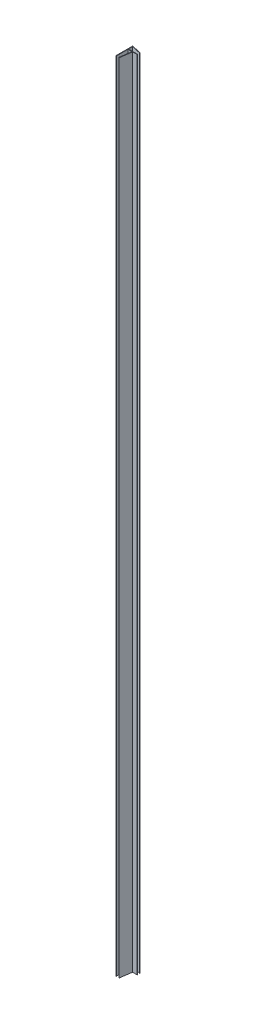
ISO-10303-21;
HEADER;
FILE_DESCRIPTION(('STEP AP214'),'2;1');
FILE_NAME('part.step','',(''),(''),'','','');
FILE_SCHEMA(('AUTOMOTIVE_DESIGN { 1 0 10303 214 1 1 1 1 }'));
ENDSEC;
DATA;
#1=APPLICATION_CONTEXT('core data for automotive mechanical design processes');
#2=APPLICATION_PROTOCOL_DEFINITION('international standard','automotive_design',2000,#1);
#3=PRODUCT_CONTEXT('',#1,'mechanical');
#4=PRODUCT('Part','Part','',(#3));
#5=PRODUCT_RELATED_PRODUCT_CATEGORY('part','',(#4));
#6=PRODUCT_DEFINITION_FORMATION('','',#4);
#7=PRODUCT_DEFINITION_CONTEXT('part definition',#1,'design');
#8=PRODUCT_DEFINITION('design','',#6,#7);
#9=PRODUCT_DEFINITION_SHAPE('','',#8);
#10=(LENGTH_UNIT() NAMED_UNIT(*) SI_UNIT(.MILLI.,.METRE.));
#11=(NAMED_UNIT(*) PLANE_ANGLE_UNIT() SI_UNIT($,.RADIAN.));
#12=(NAMED_UNIT(*) SI_UNIT($,.STERADIAN.) SOLID_ANGLE_UNIT());
#13=UNCERTAINTY_MEASURE_WITH_UNIT(LENGTH_MEASURE(1.E-05),#10,'distance_accuracy_value','');
#14=(GEOMETRIC_REPRESENTATION_CONTEXT(3) GLOBAL_UNCERTAINTY_ASSIGNED_CONTEXT((#13)) GLOBAL_UNIT_ASSIGNED_CONTEXT((#10,
#11,#12)) REPRESENTATION_CONTEXT('',''));
#15=CARTESIAN_POINT('',(0.,0.,0.));
#16=DIRECTION('',(0.,0.,1.));
#17=DIRECTION('',(1.,0.,0.));
#18=AXIS2_PLACEMENT_3D('',#15,#16,#17);
#19=CARTESIAN_POINT('',(-12.,2080.72,22.));
#20=DIRECTION('',(0.,0.,-1.));
#21=DIRECTION('',(-1.,0.,0.));
#22=AXIS2_PLACEMENT_3D('',#19,#20,#21);
#23=PLANE('',#22);
#24=DIRECTION('',(1.,0.,0.));
#25=VECTOR('',#24,1.);
#26=CARTESIAN_POINT('',(-12.,0.,22.));
#27=LINE('',#26,#25);
#28=CARTESIAN_POINT('',(-13.2,0.,22.));
#29=VERTEX_POINT('',#28);
#30=CARTESIAN_POINT('',(-12.,0.,22.));
#31=VERTEX_POINT('',#30);
#32=EDGE_CURVE('E167',#29,#31,#27,.T.);
#33=ORIENTED_EDGE('',*,*,#32,.T.);
#34=DIRECTION('',(0.,-1.,0.));
#35=VECTOR('',#34,1.);
#36=CARTESIAN_POINT('',(-12.,2080.72,22.));
#37=LINE('',#36,#35);
#38=CARTESIAN_POINT('',(-12.,2080.72,22.));
#39=VERTEX_POINT('',#38);
#40=EDGE_CURVE('E11',#39,#31,#37,.T.);
#41=ORIENTED_EDGE('',*,*,#40,.F.);
#42=DIRECTION('',(1.,0.,0.));
#43=VECTOR('',#42,1.);
#44=CARTESIAN_POINT('',(-12.,2080.72,22.));
#45=LINE('',#44,#43);
#46=CARTESIAN_POINT('',(-13.2,2080.72,22.));
#47=VERTEX_POINT('',#46);
#48=EDGE_CURVE('E193',#47,#39,#45,.T.);
#49=ORIENTED_EDGE('',*,*,#48,.F.);
#50=DIRECTION('',(0.,-1.,0.));
#51=VECTOR('',#50,1.);
#52=CARTESIAN_POINT('',(-13.2,2080.72,22.));
#53=LINE('',#52,#51);
#54=EDGE_CURVE('E163',#47,#29,#53,.T.);
#55=ORIENTED_EDGE('',*,*,#54,.T.);
#56=EDGE_LOOP('',(#33,#41,#49,#55));
#57=FACE_BOUND('',#56,.T.);
#58=ADVANCED_FACE('F35',(#57),#23,.F.);
#59=CARTESIAN_POINT('',(-12.,2080.72,22.));
#60=DIRECTION('',(-1.,0.,0.));
#61=DIRECTION('',(0.,0.,1.));
#62=AXIS2_PLACEMENT_3D('',#59,#60,#61);
#63=PLANE('',#62);
#64=DIRECTION('',(0.,0.,-1.));
#65=VECTOR('',#64,1.);
#66=CARTESIAN_POINT('',(-12.,0.,22.));
#67=LINE('',#66,#65);
#68=CARTESIAN_POINT('',(-12.,0.,-8.52573006465875));
#69=VERTEX_POINT('',#68);
#70=EDGE_CURVE('E170',#31,#69,#67,.T.);
#71=ORIENTED_EDGE('',*,*,#70,.T.);
#72=DIRECTION('',(0.,-1.,0.));
#73=VECTOR('',#72,1.);
#74=CARTESIAN_POINT('',(-12.,2080.72,-8.52573006465875));
#75=LINE('',#74,#73);
#76=CARTESIAN_POINT('',(-12.,2080.72,-8.52573006465875));
#77=VERTEX_POINT('',#76);
#78=EDGE_CURVE('E43',#77,#69,#75,.T.);
#79=ORIENTED_EDGE('',*,*,#78,.F.);
#80=DIRECTION('',(0.,0.,-1.));
#81=VECTOR('',#80,1.);
#82=CARTESIAN_POINT('',(-12.,2080.72,22.));
#83=LINE('',#82,#81);
#84=EDGE_CURVE('E112',#39,#77,#83,.T.);
#85=ORIENTED_EDGE('',*,*,#84,.F.);
#86=ORIENTED_EDGE('',*,*,#40,.T.);
#87=EDGE_LOOP('',(#71,#79,#85,#86));
#88=FACE_BOUND('',#87,.T.);
#89=ADVANCED_FACE('F281',(#88),#63,.F.);
#90=CARTESIAN_POINT('',(-12.,2080.72,-8.52573006465875));
#91=DIRECTION('',(0.,0.,-1.));
#92=DIRECTION('',(-1.,0.,0.));
#93=AXIS2_PLACEMENT_3D('',#90,#91,#92);
#94=PLANE('',#93);
#95=DIRECTION('',(1.,0.,0.));
#96=VECTOR('',#95,1.);
#97=CARTESIAN_POINT('',(-12.,0.,-8.52573006465875));
#98=LINE('',#97,#96);
#99=CARTESIAN_POINT('',(-1.20000000000002,0.,-8.52573006465875));
#100=VERTEX_POINT('',#99);
#101=EDGE_CURVE('E172',#69,#100,#98,.T.);
#102=ORIENTED_EDGE('',*,*,#101,.T.);
#103=DIRECTION('',(0.,-1.,0.));
#104=VECTOR('',#103,1.);
#105=CARTESIAN_POINT('',(-1.20000000000002,2080.72,-8.52573006465875));
#106=LINE('',#105,#104);
#107=CARTESIAN_POINT('',(-1.20000000000002,2080.72,-8.52573006465875));
#108=VERTEX_POINT('',#107);
#109=EDGE_CURVE('E218',#108,#100,#106,.T.);
#110=ORIENTED_EDGE('',*,*,#109,.F.);
#111=DIRECTION('',(1.,0.,0.));
#112=VECTOR('',#111,1.);
#113=CARTESIAN_POINT('',(-12.,2080.72,-8.52573006465875));
#114=LINE('',#113,#112);
#115=EDGE_CURVE('E226',#77,#108,#114,.T.);
#116=ORIENTED_EDGE('',*,*,#115,.F.);
#117=ORIENTED_EDGE('',*,*,#78,.T.);
#118=EDGE_LOOP('',(#102,#110,#116,#117));
#119=FACE_BOUND('',#118,.T.);
#120=ADVANCED_FACE('F224',(#119),#94,.F.);
#121=CARTESIAN_POINT('',(-1.20000000000002,2080.72,-8.52573006465875));
#122=DIRECTION('',(0.99022381065178,0.,0.139487651131801));
#123=DIRECTION('',(0.139487651131801,0.,-0.99022381065178));
#124=AXIS2_PLACEMENT_3D('',#121,#122,#123);
#125=PLANE('',#124);
#126=DIRECTION('',(-0.139487651131801,0.,0.99022381065178));
#127=VECTOR('',#126,1.);
#128=CARTESIAN_POINT('',(-1.20000000000002,0.,-8.52573006465875));
#129=LINE('',#128,#127);
#130=CARTESIAN_POINT('',(-5.50000000000001,0.,22.));
#131=VERTEX_POINT('',#130);
#132=EDGE_CURVE('E174',#100,#131,#129,.T.);
#133=ORIENTED_EDGE('',*,*,#132,.T.);
#134=DIRECTION('',(0.,-1.,0.));
#135=VECTOR('',#134,1.);
#136=CARTESIAN_POINT('',(-5.50000000000001,2080.72,22.));
#137=LINE('',#136,#135);
#138=CARTESIAN_POINT('',(-5.50000000000001,2080.72,22.));
#139=VERTEX_POINT('',#138);
#140=EDGE_CURVE('E215',#139,#131,#137,.T.);
#141=ORIENTED_EDGE('',*,*,#140,.F.);
#142=DIRECTION('',(-0.139487651131801,0.,0.99022381065178));
#143=VECTOR('',#142,1.);
#144=CARTESIAN_POINT('',(-1.20000000000002,2080.72,-8.52573006465875));
#145=LINE('',#144,#143);
#146=EDGE_CURVE('E244',#108,#139,#145,.T.);
#147=ORIENTED_EDGE('',*,*,#146,.F.);
#148=ORIENTED_EDGE('',*,*,#109,.T.);
#149=EDGE_LOOP('',(#133,#141,#147,#148));
#150=FACE_BOUND('',#149,.T.);
#151=ADVANCED_FACE('F235',(#150),#125,.F.);
#152=CARTESIAN_POINT('',(-5.50000000000001,2080.72,22.));
#153=DIRECTION('',(0.,0.,-1.));
#154=DIRECTION('',(-1.,0.,0.));
#155=AXIS2_PLACEMENT_3D('',#152,#153,#154);
#156=PLANE('',#155);
#157=DIRECTION('',(1.,0.,0.));
#158=VECTOR('',#157,1.);
#159=CARTESIAN_POINT('',(-5.50000000000001,0.,22.));
#160=LINE('',#159,#158);
#161=CARTESIAN_POINT('',(-4.28815275184089,0.,22.));
#162=VERTEX_POINT('',#161);
#163=EDGE_CURVE('E176',#131,#162,#160,.T.);
#164=ORIENTED_EDGE('',*,*,#163,.T.);
#165=DIRECTION('',(0.,-1.,0.));
#166=VECTOR('',#165,1.);
#167=CARTESIAN_POINT('',(-4.28815275184089,2080.72,22.));
#168=LINE('',#167,#166);
#169=CARTESIAN_POINT('',(-4.28815275184089,2080.72,22.));
#170=VERTEX_POINT('',#169);
#171=EDGE_CURVE('E212',#170,#162,#168,.T.);
#172=ORIENTED_EDGE('',*,*,#171,.F.);
#173=DIRECTION('',(1.,0.,0.));
#174=VECTOR('',#173,1.);
#175=CARTESIAN_POINT('',(-5.50000000000001,2080.72,22.));
#176=LINE('',#175,#174);
#177=EDGE_CURVE('E241',#139,#170,#176,.T.);
#178=ORIENTED_EDGE('',*,*,#177,.F.);
#179=ORIENTED_EDGE('',*,*,#140,.T.);
#180=EDGE_LOOP('',(#164,#172,#178,#179));
#181=FACE_BOUND('',#180,.T.);
#182=ADVANCED_FACE('F239',(#181),#156,.F.);
#183=CARTESIAN_POINT('',(-4.28815275184089,2080.72,22.));
#184=DIRECTION('',(-0.99022381065178,0.,-0.139487651131801));
#185=DIRECTION('',(-0.139487651131801,0.,0.990223810651781));
#186=AXIS2_PLACEMENT_3D('',#183,#184,#185);
#187=PLANE('',#186);
#188=DIRECTION('',(0.139487651131801,0.,-0.99022381065178));
#189=VECTOR('',#188,1.);
#190=CARTESIAN_POINT('',(-4.28815275184089,0.,22.));
#191=LINE('',#190,#189);
#192=CARTESIAN_POINT('',(0.0118472481591028,0.,-8.52573006465875));
#193=VERTEX_POINT('',#192);
#194=EDGE_CURVE('E178',#162,#193,#191,.T.);
#195=ORIENTED_EDGE('',*,*,#194,.T.);
#196=DIRECTION('',(0.,-1.,0.));
#197=VECTOR('',#196,1.);
#198=CARTESIAN_POINT('',(0.0118472481591028,2080.72,-8.52573006465875));
#199=LINE('',#198,#197);
#200=CARTESIAN_POINT('',(0.0118472481591028,2080.72,-8.52573006465875));
#201=VERTEX_POINT('',#200);
#202=EDGE_CURVE('E209',#201,#193,#199,.T.);
#203=ORIENTED_EDGE('',*,*,#202,.F.);
#204=DIRECTION('',(0.139487651131801,0.,-0.99022381065178));
#205=VECTOR('',#204,1.);
#206=CARTESIAN_POINT('',(-4.28815275184089,2080.72,22.));
#207=LINE('',#206,#205);
#208=EDGE_CURVE('E243',#170,#201,#207,.T.);
#209=ORIENTED_EDGE('',*,*,#208,.F.);
#210=ORIENTED_EDGE('',*,*,#171,.T.);
#211=EDGE_LOOP('',(#195,#203,#209,#210));
#212=FACE_BOUND('',#211,.T.);
#213=ADVANCED_FACE('F294',(#212),#187,.F.);
#214=CARTESIAN_POINT('',(0.0118472481591028,2080.72,-8.52573006465875));
#215=DIRECTION('',(0.,0.,-1.));
#216=DIRECTION('',(-1.,0.,0.));
#217=AXIS2_PLACEMENT_3D('',#214,#215,#216);
#218=PLANE('',#217);
#219=DIRECTION('',(1.,0.,0.));
#220=VECTOR('',#219,1.);
#221=CARTESIAN_POINT('',(0.0118472481591028,0.,-8.52573006465875));
#222=LINE('',#221,#220);
#223=CARTESIAN_POINT('',(12.,0.,-8.52573006465875));
#224=VERTEX_POINT('',#223);
#225=EDGE_CURVE('E180',#193,#224,#222,.T.);
#226=ORIENTED_EDGE('',*,*,#225,.T.);
#227=DIRECTION('',(0.,-1.,0.));
#228=VECTOR('',#227,1.);
#229=CARTESIAN_POINT('',(12.,2080.72,-8.52573006465875));
#230=LINE('',#229,#228);
#231=CARTESIAN_POINT('',(12.,2080.72,-8.52573006465875));
#232=VERTEX_POINT('',#231);
#233=EDGE_CURVE('E206',#232,#224,#230,.T.);
#234=ORIENTED_EDGE('',*,*,#233,.F.);
#235=DIRECTION('',(1.,0.,0.));
#236=VECTOR('',#235,1.);
#237=CARTESIAN_POINT('',(0.0118472481591028,2080.72,-8.52573006465875));
#238=LINE('',#237,#236);
#239=EDGE_CURVE('E246',#201,#232,#238,.T.);
#240=ORIENTED_EDGE('',*,*,#239,.F.);
#241=ORIENTED_EDGE('',*,*,#202,.T.);
#242=EDGE_LOOP('',(#226,#234,#240,#241));
#243=FACE_BOUND('',#242,.T.);
#244=ADVANCED_FACE('F297',(#243),#218,.F.);
#245=CARTESIAN_POINT('',(12.,2080.72,-8.52573006465875));
#246=DIRECTION('',(-1.,0.,0.));
#247=DIRECTION('',(0.,0.,1.));
#248=AXIS2_PLACEMENT_3D('',#245,#246,#247);
#249=PLANE('',#248);
#250=DIRECTION('',(0.,0.,-1.));
#251=VECTOR('',#250,1.);
#252=CARTESIAN_POINT('',(12.,0.,-8.52573006465875));
#253=LINE('',#252,#251);
#254=CARTESIAN_POINT('',(12.,0.,-9.72573006465875));
#255=VERTEX_POINT('',#254);
#256=EDGE_CURVE('E182',#224,#255,#253,.T.);
#257=ORIENTED_EDGE('',*,*,#256,.T.);
#258=DIRECTION('',(0.,-1.,0.));
#259=VECTOR('',#258,1.);
#260=CARTESIAN_POINT('',(12.,2080.72,-9.72573006465875));
#261=LINE('',#260,#259);
#262=CARTESIAN_POINT('',(12.,2080.72,-9.72573006465875));
#263=VERTEX_POINT('',#262);
#264=EDGE_CURVE('E203',#263,#255,#261,.T.);
#265=ORIENTED_EDGE('',*,*,#264,.F.);
#266=DIRECTION('',(0.,0.,-1.));
#267=VECTOR('',#266,1.);
#268=CARTESIAN_POINT('',(12.,2080.72,-8.52573006465875));
#269=LINE('',#268,#267);
#270=EDGE_CURVE('E252',#232,#263,#269,.T.);
#271=ORIENTED_EDGE('',*,*,#270,.F.);
#272=ORIENTED_EDGE('',*,*,#233,.T.);
#273=EDGE_LOOP('',(#257,#265,#271,#272));
#274=FACE_BOUND('',#273,.T.);
#275=ADVANCED_FACE('F301',(#274),#249,.F.);
#276=CARTESIAN_POINT('',(12.,2080.72,-9.72573006465875));
#277=DIRECTION('',(0.,0.,1.));
#278=DIRECTION('',(1.,0.,0.));
#279=AXIS2_PLACEMENT_3D('',#276,#277,#278);
#280=PLANE('',#279);
#281=DIRECTION('',(-1.,0.,0.));
#282=VECTOR('',#281,1.);
#283=CARTESIAN_POINT('',(12.,0.,-9.72573006465875));
#284=LINE('',#283,#282);
#285=CARTESIAN_POINT('',(-12.,0.,-9.72573006465875));
#286=VERTEX_POINT('',#285);
#287=EDGE_CURVE('E184',#255,#286,#284,.T.);
#288=ORIENTED_EDGE('',*,*,#287,.T.);
#289=DIRECTION('',(0.,-1.,0.));
#290=VECTOR('',#289,1.);
#291=CARTESIAN_POINT('',(-12.,2080.72,-9.72573006465875));
#292=LINE('',#291,#290);
#293=CARTESIAN_POINT('',(-12.,2080.72,-9.72573006465875));
#294=VERTEX_POINT('',#293);
#295=EDGE_CURVE('E200',#294,#286,#292,.T.);
#296=ORIENTED_EDGE('',*,*,#295,.F.);
#297=DIRECTION('',(-1.,0.,0.));
#298=VECTOR('',#297,1.);
#299=CARTESIAN_POINT('',(12.,2080.72,-9.72573006465875));
#300=LINE('',#299,#298);
#301=EDGE_CURVE('E254',#263,#294,#300,.T.);
#302=ORIENTED_EDGE('',*,*,#301,.F.);
#303=ORIENTED_EDGE('',*,*,#264,.T.);
#304=EDGE_LOOP('',(#288,#296,#302,#303));
#305=FACE_BOUND('',#304,.T.);
#306=ADVANCED_FACE('F305',(#305),#280,.F.);
#307=CARTESIAN_POINT('',(-12.,2080.72,-9.72573006465875));
#308=DIRECTION('',(-1.,0.,0.));
#309=DIRECTION('',(0.,0.,1.));
#310=AXIS2_PLACEMENT_3D('',#307,#308,#309);
#311=PLANE('',#310);
#312=DIRECTION('',(0.,0.,-1.));
#313=VECTOR('',#312,1.);
#314=CARTESIAN_POINT('',(-12.,0.,-9.72573006465875));
#315=LINE('',#314,#313);
#316=CARTESIAN_POINT('',(-12.,0.,-20.5257300646587));
#317=VERTEX_POINT('',#316);
#318=EDGE_CURVE('E186',#286,#317,#315,.T.);
#319=ORIENTED_EDGE('',*,*,#318,.T.);
#320=DIRECTION('',(0.,-1.,0.));
#321=VECTOR('',#320,1.);
#322=CARTESIAN_POINT('',(-12.,2080.72,-20.5257300646587));
#323=LINE('',#322,#321);
#324=CARTESIAN_POINT('',(-12.,2080.72,-20.5257300646587));
#325=VERTEX_POINT('',#324);
#326=EDGE_CURVE('E197',#325,#317,#323,.T.);
#327=ORIENTED_EDGE('',*,*,#326,.F.);
#328=DIRECTION('',(0.,0.,-1.));
#329=VECTOR('',#328,1.);
#330=CARTESIAN_POINT('',(-12.,2080.72,-9.72573006465875));
#331=LINE('',#330,#329);
#332=EDGE_CURVE('E256',#294,#325,#331,.T.);
#333=ORIENTED_EDGE('',*,*,#332,.F.);
#334=ORIENTED_EDGE('',*,*,#295,.T.);
#335=EDGE_LOOP('',(#319,#327,#333,#334));
#336=FACE_BOUND('',#335,.T.);
#337=ADVANCED_FACE('F262',(#336),#311,.F.);
#338=CARTESIAN_POINT('',(-12.,2080.72,-20.5257300646587));
#339=DIRECTION('',(0.215637876436961,0.,-0.976473402733407));
#340=DIRECTION('',(-0.976473402733407,0.,-0.215637876436961));
#341=AXIS2_PLACEMENT_3D('',#338,#339,#340);
#342=PLANE('',#341);
#343=DIRECTION('',(0.976473402733407,0.,0.215637876436961));
#344=VECTOR('',#343,1.);
#345=CARTESIAN_POINT('',(-12.,0.,-20.5257300646587));
#346=LINE('',#345,#344);
#347=CARTESIAN_POINT('',(12.,0.,-15.2257300646587));
#348=VERTEX_POINT('',#347);
#349=EDGE_CURVE('E188',#317,#348,#346,.T.);
#350=ORIENTED_EDGE('',*,*,#349,.T.);
#351=DIRECTION('',(0.,-1.,0.));
#352=VECTOR('',#351,1.);
#353=CARTESIAN_POINT('',(12.,2080.72,-15.2257300646587));
#354=LINE('',#353,#352);
#355=CARTESIAN_POINT('',(12.,2080.72,-15.2257300646587));
#356=VERTEX_POINT('',#355);
#357=EDGE_CURVE('E158',#356,#348,#354,.T.);
#358=ORIENTED_EDGE('',*,*,#357,.F.);
#359=DIRECTION('',(0.976473402733407,0.,0.215637876436961));
#360=VECTOR('',#359,1.);
#361=CARTESIAN_POINT('',(-12.,2080.72,-20.5257300646587));
#362=LINE('',#361,#360);
#363=EDGE_CURVE('E149',#325,#356,#362,.T.);
#364=ORIENTED_EDGE('',*,*,#363,.F.);
#365=ORIENTED_EDGE('',*,*,#326,.T.);
#366=EDGE_LOOP('',(#350,#358,#364,#365));
#367=FACE_BOUND('',#366,.T.);
#368=ADVANCED_FACE('F266',(#367),#342,.F.);
#369=CARTESIAN_POINT('',(12.,2080.72,-15.2257300646587));
#370=DIRECTION('',(-1.,0.,0.));
#371=DIRECTION('',(0.,0.,1.));
#372=AXIS2_PLACEMENT_3D('',#369,#370,#371);
#373=PLANE('',#372);
#374=DIRECTION('',(0.,0.,-1.));
#375=VECTOR('',#374,1.);
#376=CARTESIAN_POINT('',(12.,0.,-15.2257300646587));
#377=LINE('',#376,#375);
#378=CARTESIAN_POINT('',(12.,0.,-16.4546421851946));
#379=VERTEX_POINT('',#378);
#380=EDGE_CURVE('E157',#348,#379,#377,.T.);
#381=ORIENTED_EDGE('',*,*,#380,.T.);
#382=DIRECTION('',(0.,-1.,0.));
#383=VECTOR('',#382,1.);
#384=CARTESIAN_POINT('',(12.,2080.72,-16.4546421851946));
#385=LINE('',#384,#383);
#386=CARTESIAN_POINT('',(12.,2080.72,-16.4546421851946));
#387=VERTEX_POINT('',#386);
#388=EDGE_CURVE('E154',#387,#379,#385,.T.);
#389=ORIENTED_EDGE('',*,*,#388,.F.);
#390=DIRECTION('',(0.,0.,-1.));
#391=VECTOR('',#390,1.);
#392=CARTESIAN_POINT('',(12.,2080.72,-15.2257300646587));
#393=LINE('',#392,#391);
#394=EDGE_CURVE('E143',#356,#387,#393,.T.);
#395=ORIENTED_EDGE('',*,*,#394,.F.);
#396=ORIENTED_EDGE('',*,*,#357,.T.);
#397=EDGE_LOOP('',(#381,#389,#395,#396));
#398=FACE_BOUND('',#397,.T.);
#399=ADVANCED_FACE('F155',(#398),#373,.F.);
#400=CARTESIAN_POINT('',(12.,2080.72,-16.4546421851946));
#401=DIRECTION('',(-0.215637876436961,0.,0.976473402733407));
#402=DIRECTION('',(0.976473402733407,0.,0.215637876436961));
#403=AXIS2_PLACEMENT_3D('',#400,#401,#402);
#404=PLANE('',#403);
#405=DIRECTION('',(-0.976473402733407,0.,-0.215637876436961));
#406=VECTOR('',#405,1.);
#407=CARTESIAN_POINT('',(12.,0.,-16.4546421851946));
#408=LINE('',#407,#406);
#409=CARTESIAN_POINT('',(-13.2,0.,-22.0196421851946));
#410=VERTEX_POINT('',#409);
#411=EDGE_CURVE('E98',#379,#410,#408,.T.);
#412=ORIENTED_EDGE('',*,*,#411,.T.);
#413=DIRECTION('',(0.,-1.,0.));
#414=VECTOR('',#413,1.);
#415=CARTESIAN_POINT('',(-13.2,2080.72,-22.0196421851946));
#416=LINE('',#415,#414);
#417=CARTESIAN_POINT('',(-13.2,2080.72,-22.0196421851946));
#418=VERTEX_POINT('',#417);
#419=EDGE_CURVE('E159',#418,#410,#416,.T.);
#420=ORIENTED_EDGE('',*,*,#419,.F.);
#421=DIRECTION('',(-0.976473402733407,0.,-0.215637876436961));
#422=VECTOR('',#421,1.);
#423=CARTESIAN_POINT('',(12.,2080.72,-16.4546421851946));
#424=LINE('',#423,#422);
#425=EDGE_CURVE('E147',#387,#418,#424,.T.);
#426=ORIENTED_EDGE('',*,*,#425,.F.);
#427=ORIENTED_EDGE('',*,*,#388,.T.);
#428=EDGE_LOOP('',(#412,#420,#426,#427));
#429=FACE_BOUND('',#428,.T.);
#430=ADVANCED_FACE('F161',(#429),#404,.F.);
#431=CARTESIAN_POINT('',(-13.2,2080.72,-22.0196421851946));
#432=DIRECTION('',(1.,0.,0.));
#433=DIRECTION('',(0.,0.,-1.));
#434=AXIS2_PLACEMENT_3D('',#431,#432,#433);
#435=PLANE('',#434);
#436=DIRECTION('',(0.,0.,1.));
#437=VECTOR('',#436,1.);
#438=CARTESIAN_POINT('',(-13.2,0.,-22.0196421851946));
#439=LINE('',#438,#437);
#440=EDGE_CURVE('E104',#410,#29,#439,.T.);
#441=ORIENTED_EDGE('',*,*,#440,.T.);
#442=ORIENTED_EDGE('',*,*,#54,.F.);
#443=DIRECTION('',(0.,0.,1.));
#444=VECTOR('',#443,1.);
#445=CARTESIAN_POINT('',(-13.2,2080.72,-22.0196421851946));
#446=LINE('',#445,#444);
#447=EDGE_CURVE('E51',#418,#47,#446,.T.);
#448=ORIENTED_EDGE('',*,*,#447,.F.);
#449=ORIENTED_EDGE('',*,*,#419,.T.);
#450=EDGE_LOOP('',(#441,#442,#448,#449));
#451=FACE_BOUND('',#450,.T.);
#452=ADVANCED_FACE('F270',(#451),#435,.F.);
#453=CARTESIAN_POINT('',(0.,2080.72,0.));
#454=DIRECTION('',(0.,1.,0.));
#455=DIRECTION('',(0.,0.,1.));
#456=AXIS2_PLACEMENT_3D('',#453,#454,#455);
#457=PLANE('',#456);
#458=ORIENTED_EDGE('',*,*,#48,.T.);
#459=ORIENTED_EDGE('',*,*,#84,.T.);
#460=ORIENTED_EDGE('',*,*,#115,.T.);
#461=ORIENTED_EDGE('',*,*,#146,.T.);
#462=ORIENTED_EDGE('',*,*,#177,.T.);
#463=ORIENTED_EDGE('',*,*,#208,.T.);
#464=ORIENTED_EDGE('',*,*,#239,.T.);
#465=ORIENTED_EDGE('',*,*,#270,.T.);
#466=ORIENTED_EDGE('',*,*,#301,.T.);
#467=ORIENTED_EDGE('',*,*,#332,.T.);
#468=ORIENTED_EDGE('',*,*,#363,.T.);
#469=ORIENTED_EDGE('',*,*,#394,.T.);
#470=ORIENTED_EDGE('',*,*,#425,.T.);
#471=ORIENTED_EDGE('',*,*,#447,.T.);
#472=EDGE_LOOP('',(#458,#459,#460,#461,#462,#463,#464,#465,#466,#467,#468,#469,#470,#471));
#473=FACE_BOUND('',#472,.T.);
#474=ADVANCED_FACE('F145',(#473),#457,.T.);
#475=CARTESIAN_POINT('',(0.,0.,0.));
#476=DIRECTION('',(0.,1.,0.));
#477=DIRECTION('',(0.,0.,1.));
#478=AXIS2_PLACEMENT_3D('',#475,#476,#477);
#479=PLANE('',#478);
#480=ORIENTED_EDGE('',*,*,#32,.F.);
#481=ORIENTED_EDGE('',*,*,#440,.F.);
#482=ORIENTED_EDGE('',*,*,#411,.F.);
#483=ORIENTED_EDGE('',*,*,#380,.F.);
#484=ORIENTED_EDGE('',*,*,#349,.F.);
#485=ORIENTED_EDGE('',*,*,#318,.F.);
#486=ORIENTED_EDGE('',*,*,#287,.F.);
#487=ORIENTED_EDGE('',*,*,#256,.F.);
#488=ORIENTED_EDGE('',*,*,#225,.F.);
#489=ORIENTED_EDGE('',*,*,#194,.F.);
#490=ORIENTED_EDGE('',*,*,#163,.F.);
#491=ORIENTED_EDGE('',*,*,#132,.F.);
#492=ORIENTED_EDGE('',*,*,#101,.F.);
#493=ORIENTED_EDGE('',*,*,#70,.F.);
#494=EDGE_LOOP('',(#480,#481,#482,#483,#484,#485,#486,#487,#488,#489,#490,#491,#492,#493));
#495=FACE_BOUND('',#494,.T.);
#496=ADVANCED_FACE('F230',(#495),#479,.F.);
#497=CLOSED_SHELL('',(#58,#89,#120,#151,#182,#213,#244,#275,#306,#337,#368,#399,#430,#452,#474,#496));
#498=MANIFOLD_SOLID_BREP('B2',#497);
#499=ADVANCED_BREP_SHAPE_REPRESENTATION('',(#18,#498),#14);
#500=SHAPE_DEFINITION_REPRESENTATION(#9,#499);
ENDSEC;
END-ISO-10303-21;
